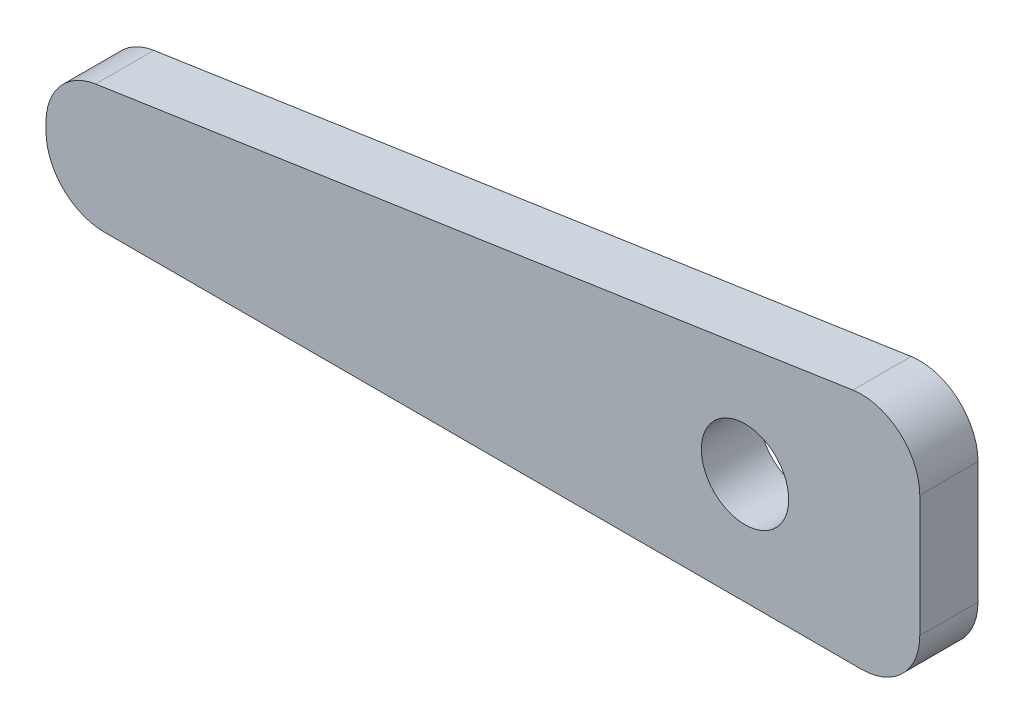
ISO-10303-21;
HEADER;
FILE_DESCRIPTION(('STEP AP214'),'2;1');
FILE_NAME('part.step','',(''),(''),'','','');
FILE_SCHEMA(('AUTOMOTIVE_DESIGN { 1 0 10303 214 1 1 1 1 }'));
ENDSEC;
DATA;
#1=APPLICATION_CONTEXT('core data for automotive mechanical design processes');
#2=APPLICATION_PROTOCOL_DEFINITION('international standard','automotive_design',2000,#1);
#3=PRODUCT_CONTEXT('',#1,'mechanical');
#4=PRODUCT('Part','Part','',(#3));
#5=PRODUCT_RELATED_PRODUCT_CATEGORY('part','',(#4));
#6=PRODUCT_DEFINITION_FORMATION('','',#4);
#7=PRODUCT_DEFINITION_CONTEXT('part definition',#1,'design');
#8=PRODUCT_DEFINITION('design','',#6,#7);
#9=PRODUCT_DEFINITION_SHAPE('','',#8);
#10=(LENGTH_UNIT() NAMED_UNIT(*) SI_UNIT(.MILLI.,.METRE.));
#11=(NAMED_UNIT(*) PLANE_ANGLE_UNIT() SI_UNIT($,.RADIAN.));
#12=(NAMED_UNIT(*) SI_UNIT($,.STERADIAN.) SOLID_ANGLE_UNIT());
#13=UNCERTAINTY_MEASURE_WITH_UNIT(LENGTH_MEASURE(1.E-05),#10,'distance_accuracy_value','');
#14=(GEOMETRIC_REPRESENTATION_CONTEXT(3) GLOBAL_UNCERTAINTY_ASSIGNED_CONTEXT((#13)) GLOBAL_UNIT_ASSIGNED_CONTEXT((#10,
#11,#12)) REPRESENTATION_CONTEXT('',''));
#15=CARTESIAN_POINT('',(0.,0.,0.));
#16=DIRECTION('',(0.,0.,1.));
#17=DIRECTION('',(1.,0.,0.));
#18=AXIS2_PLACEMENT_3D('',#15,#16,#17);
#19=CARTESIAN_POINT('',(-377.825,3.17499999999995,3.175));
#20=DIRECTION('',(0.,0.,-1.));
#21=DIRECTION('',(-1.,0.,0.));
#22=AXIS2_PLACEMENT_3D('',#19,#20,#21);
#23=CYLINDRICAL_SURFACE('',#22,3.17499999999999);
#24=CARTESIAN_POINT('',(-377.825,3.17499999999995,0.));
#25=DIRECTION('',(0.,0.,1.));
#26=DIRECTION('',(1.,0.,0.));
#27=AXIS2_PLACEMENT_3D('',#24,#25,#26);
#28=CIRCLE('',#27,3.17499999999999);
#29=CARTESIAN_POINT('',(-377.825,0.,0.));
#30=VERTEX_POINT('',#29);
#31=CARTESIAN_POINT('',(-381.,3.17499999999998,0.));
#32=VERTEX_POINT('',#31);
#33=EDGE_CURVE('E130',#30,#32,#28,.F.);
#34=ORIENTED_EDGE('',*,*,#33,.F.);
#35=DIRECTION('',(0.,0.,-1.));
#36=VECTOR('',#35,1.);
#37=CARTESIAN_POINT('',(-377.825,0.,3.175));
#38=LINE('',#37,#36);
#39=CARTESIAN_POINT('',(-377.825,0.,3.175));
#40=VERTEX_POINT('',#39);
#41=EDGE_CURVE('E11',#40,#30,#38,.T.);
#42=ORIENTED_EDGE('',*,*,#41,.F.);
#43=CARTESIAN_POINT('',(-377.825,3.17499999999995,3.175));
#44=DIRECTION('',(0.,0.,1.));
#45=DIRECTION('',(1.,0.,0.));
#46=AXIS2_PLACEMENT_3D('',#43,#44,#45);
#47=CIRCLE('',#46,3.17499999999999);
#48=CARTESIAN_POINT('',(-381.,3.17499999999998,3.175));
#49=VERTEX_POINT('',#48);
#50=EDGE_CURVE('E179',#40,#49,#47,.F.);
#51=ORIENTED_EDGE('',*,*,#50,.T.);
#52=DIRECTION('',(0.,0.,-1.));
#53=VECTOR('',#52,1.);
#54=CARTESIAN_POINT('',(-381.,3.17499999999998,3.175));
#55=LINE('',#54,#53);
#56=EDGE_CURVE('E50',#49,#32,#55,.T.);
#57=ORIENTED_EDGE('',*,*,#56,.T.);
#58=EDGE_LOOP('',(#34,#42,#51,#57));
#59=FACE_BOUND('',#58,.T.);
#60=ADVANCED_FACE('F33',(#59),#23,.T.);
#61=CARTESIAN_POINT('',(0.,0.,3.175));
#62=DIRECTION('',(0.,-1.,0.));
#63=DIRECTION('',(1.,0.,0.));
#64=AXIS2_PLACEMENT_3D('',#61,#62,#63);
#65=PLANE('',#64);
#66=DIRECTION('',(-1.,0.,0.));
#67=VECTOR('',#66,1.);
#68=CARTESIAN_POINT('',(0.,0.,0.));
#69=LINE('',#68,#67);
#70=CARTESIAN_POINT('',(-336.55,0.,0.));
#71=VERTEX_POINT('',#70);
#72=EDGE_CURVE('E132',#71,#30,#69,.T.);
#73=ORIENTED_EDGE('',*,*,#72,.F.);
#74=DIRECTION('',(0.,0.,-1.));
#75=VECTOR('',#74,1.);
#76=CARTESIAN_POINT('',(-336.55,0.,3.175));
#77=LINE('',#76,#75);
#78=CARTESIAN_POINT('',(-336.55,0.,3.175));
#79=VERTEX_POINT('',#78);
#80=EDGE_CURVE('E42',#79,#71,#77,.T.);
#81=ORIENTED_EDGE('',*,*,#80,.F.);
#82=DIRECTION('',(-1.,0.,0.));
#83=VECTOR('',#82,1.);
#84=CARTESIAN_POINT('',(0.,0.,3.175));
#85=LINE('',#84,#83);
#86=EDGE_CURVE('E176',#79,#40,#85,.T.);
#87=ORIENTED_EDGE('',*,*,#86,.T.);
#88=ORIENTED_EDGE('',*,*,#41,.T.);
#89=EDGE_LOOP('',(#73,#81,#87,#88));
#90=FACE_BOUND('',#89,.T.);
#91=ADVANCED_FACE('F167',(#90),#65,.T.);
#92=CARTESIAN_POINT('',(-336.55,3.17499999999996,3.175));
#93=DIRECTION('',(0.,0.,-1.));
#94=DIRECTION('',(-1.,0.,0.));
#95=AXIS2_PLACEMENT_3D('',#92,#93,#94);
#96=CYLINDRICAL_SURFACE('',#95,3.17499999999999);
#97=CARTESIAN_POINT('',(-336.55,3.17499999999996,0.));
#98=DIRECTION('',(0.,0.,1.));
#99=DIRECTION('',(1.,0.,0.));
#100=AXIS2_PLACEMENT_3D('',#97,#98,#99);
#101=CIRCLE('',#100,3.17499999999999);
#102=CARTESIAN_POINT('',(-333.375,3.17499999999998,0.));
#103=VERTEX_POINT('',#102);
#104=EDGE_CURVE('E135',#103,#71,#101,.F.);
#105=ORIENTED_EDGE('',*,*,#104,.F.);
#106=DIRECTION('',(0.,0.,-1.));
#107=VECTOR('',#106,1.);
#108=CARTESIAN_POINT('',(-333.375,3.17499999999998,3.175));
#109=LINE('',#108,#107);
#110=CARTESIAN_POINT('',(-333.375,3.17499999999998,3.175));
#111=VERTEX_POINT('',#110);
#112=EDGE_CURVE('E156',#111,#103,#109,.T.);
#113=ORIENTED_EDGE('',*,*,#112,.F.);
#114=CARTESIAN_POINT('',(-336.55,3.17499999999996,3.175));
#115=DIRECTION('',(0.,0.,1.));
#116=DIRECTION('',(1.,0.,0.));
#117=AXIS2_PLACEMENT_3D('',#114,#115,#116);
#118=CIRCLE('',#117,3.17499999999999);
#119=EDGE_CURVE('E163',#111,#79,#118,.F.);
#120=ORIENTED_EDGE('',*,*,#119,.T.);
#121=ORIENTED_EDGE('',*,*,#80,.T.);
#122=EDGE_LOOP('',(#105,#113,#120,#121));
#123=FACE_BOUND('',#122,.T.);
#124=ADVANCED_FACE('F161',(#123),#96,.T.);
#125=CARTESIAN_POINT('',(-333.375,0.,3.175));
#126=DIRECTION('',(1.,0.,0.));
#127=DIRECTION('',(0.,0.,-1.));
#128=AXIS2_PLACEMENT_3D('',#125,#126,#127);
#129=PLANE('',#128);
#130=DIRECTION('',(0.,-1.,0.));
#131=VECTOR('',#130,1.);
#132=CARTESIAN_POINT('',(-333.375,0.,0.));
#133=LINE('',#132,#131);
#134=CARTESIAN_POINT('',(-333.375,9.80697993893506,0.));
#135=VERTEX_POINT('',#134);
#136=EDGE_CURVE('E138',#135,#103,#133,.T.);
#137=ORIENTED_EDGE('',*,*,#136,.F.);
#138=DIRECTION('',(0.,0.,-1.));
#139=VECTOR('',#138,1.);
#140=CARTESIAN_POINT('',(-333.375,9.80697993893506,3.175));
#141=LINE('',#140,#139);
#142=CARTESIAN_POINT('',(-333.375,9.80697993893506,3.175));
#143=VERTEX_POINT('',#142);
#144=EDGE_CURVE('E154',#143,#135,#141,.T.);
#145=ORIENTED_EDGE('',*,*,#144,.F.);
#146=DIRECTION('',(0.,-1.,0.));
#147=VECTOR('',#146,1.);
#148=CARTESIAN_POINT('',(-333.375,0.,3.175));
#149=LINE('',#148,#147);
#150=EDGE_CURVE('E175',#143,#111,#149,.T.);
#151=ORIENTED_EDGE('',*,*,#150,.T.);
#152=ORIENTED_EDGE('',*,*,#112,.T.);
#153=EDGE_LOOP('',(#137,#145,#151,#152));
#154=FACE_BOUND('',#153,.T.);
#155=ADVANCED_FACE('F173',(#154),#129,.T.);
#156=CARTESIAN_POINT('',(-336.55,9.80697993893509,3.175));
#157=DIRECTION('',(0.,0.,-1.));
#158=DIRECTION('',(-1.,0.,0.));
#159=AXIS2_PLACEMENT_3D('',#156,#157,#158);
#160=CYLINDRICAL_SURFACE('',#159,3.17499999999999);
#161=CARTESIAN_POINT('',(-336.55,9.80697993893509,0.));
#162=DIRECTION('',(0.,0.,1.));
#163=DIRECTION('',(1.,0.,0.));
#164=AXIS2_PLACEMENT_3D('',#161,#162,#163);
#165=CIRCLE('',#164,3.17499999999999);
#166=CARTESIAN_POINT('',(-337.020980938054,12.9468528592919,0.));
#167=VERTEX_POINT('',#166);
#168=EDGE_CURVE('E141',#135,#167,#165,.T.);
#169=ORIENTED_EDGE('',*,*,#168,.T.);
#170=DIRECTION('',(0.,0.,-1.));
#171=VECTOR('',#170,1.);
#172=CARTESIAN_POINT('',(-337.020980938054,12.9468528592919,3.175));
#173=LINE('',#172,#171);
#174=CARTESIAN_POINT('',(-337.020980938054,12.9468528592919,3.175));
#175=VERTEX_POINT('',#174);
#176=EDGE_CURVE('E109',#175,#167,#173,.T.);
#177=ORIENTED_EDGE('',*,*,#176,.F.);
#178=CARTESIAN_POINT('',(-336.55,9.80697993893509,3.175));
#179=DIRECTION('',(0.,0.,1.));
#180=DIRECTION('',(1.,0.,0.));
#181=AXIS2_PLACEMENT_3D('',#178,#179,#180);
#182=CIRCLE('',#181,3.17499999999999);
#183=EDGE_CURVE('E118',#143,#175,#182,.T.);
#184=ORIENTED_EDGE('',*,*,#183,.F.);
#185=ORIENTED_EDGE('',*,*,#144,.T.);
#186=EDGE_LOOP('',(#169,#177,#184,#185));
#187=FACE_BOUND('',#186,.T.);
#188=ADVANCED_FACE('F208',(#187),#160,.T.);
#189=CARTESIAN_POINT('',(-9.31540342298291,62.1026894865526,3.175));
#190=DIRECTION('',(-0.148340452930245,0.988936352868297,0.));
#191=DIRECTION('',(-0.988936352868298,-0.148340452930245,0.));
#192=AXIS2_PLACEMENT_3D('',#189,#190,#191);
#193=PLANE('',#192);
#194=DIRECTION('',(0.988936352868298,0.148340452930245,0.));
#195=VECTOR('',#194,1.);
#196=CARTESIAN_POINT('',(-9.31540342298291,62.1026894865526,0.));
#197=LINE('',#196,#195);
#198=CARTESIAN_POINT('',(-378.295980938054,6.75560285929194,0.));
#199=VERTEX_POINT('',#198);
#200=EDGE_CURVE('E105',#199,#167,#197,.T.);
#201=ORIENTED_EDGE('',*,*,#200,.F.);
#202=DIRECTION('',(0.,0.,-1.));
#203=VECTOR('',#202,1.);
#204=CARTESIAN_POINT('',(-378.295980938054,6.75560285929194,3.175));
#205=LINE('',#204,#203);
#206=CARTESIAN_POINT('',(-378.295980938054,6.75560285929194,3.175));
#207=VERTEX_POINT('',#206);
#208=EDGE_CURVE('E100',#207,#199,#205,.T.);
#209=ORIENTED_EDGE('',*,*,#208,.F.);
#210=DIRECTION('',(0.988936352868298,0.148340452930245,0.));
#211=VECTOR('',#210,1.);
#212=CARTESIAN_POINT('',(-9.31540342298291,62.1026894865526,3.175));
#213=LINE('',#212,#211);
#214=EDGE_CURVE('E103',#207,#175,#213,.T.);
#215=ORIENTED_EDGE('',*,*,#214,.T.);
#216=ORIENTED_EDGE('',*,*,#176,.T.);
#217=EDGE_LOOP('',(#201,#209,#215,#216));
#218=FACE_BOUND('',#217,.T.);
#219=ADVANCED_FACE('F102',(#218),#193,.T.);
#220=CARTESIAN_POINT('',(-377.825,3.61572993893508,3.175));
#221=DIRECTION('',(0.,0.,-1.));
#222=DIRECTION('',(-1.,0.,0.));
#223=AXIS2_PLACEMENT_3D('',#220,#221,#222);
#224=CYLINDRICAL_SURFACE('',#223,3.17499999999999);
#225=CARTESIAN_POINT('',(-377.825,3.61572993893508,0.));
#226=DIRECTION('',(0.,0.,1.));
#227=DIRECTION('',(1.,0.,0.));
#228=AXIS2_PLACEMENT_3D('',#225,#226,#227);
#229=CIRCLE('',#228,3.17499999999999);
#230=CARTESIAN_POINT('',(-381.,3.61572993893506,0.));
#231=VERTEX_POINT('',#230);
#232=EDGE_CURVE('E145',#231,#199,#229,.F.);
#233=ORIENTED_EDGE('',*,*,#232,.F.);
#234=DIRECTION('',(0.,0.,-1.));
#235=VECTOR('',#234,1.);
#236=CARTESIAN_POINT('',(-381.,3.61572993893506,3.175));
#237=LINE('',#236,#235);
#238=CARTESIAN_POINT('',(-381.,3.61572993893506,3.175));
#239=VERTEX_POINT('',#238);
#240=EDGE_CURVE('E75',#239,#231,#237,.T.);
#241=ORIENTED_EDGE('',*,*,#240,.F.);
#242=CARTESIAN_POINT('',(-377.825,3.61572993893508,3.175));
#243=DIRECTION('',(0.,0.,1.));
#244=DIRECTION('',(1.,0.,0.));
#245=AXIS2_PLACEMENT_3D('',#242,#243,#244);
#246=CIRCLE('',#245,3.17499999999999);
#247=EDGE_CURVE('E115',#239,#207,#246,.F.);
#248=ORIENTED_EDGE('',*,*,#247,.T.);
#249=ORIENTED_EDGE('',*,*,#208,.T.);
#250=EDGE_LOOP('',(#233,#241,#248,#249));
#251=FACE_BOUND('',#250,.T.);
#252=ADVANCED_FACE('F121',(#251),#224,.T.);
#253=CARTESIAN_POINT('',(-342.9,6.03249999999891,3.175));
#254=DIRECTION('',(0.,0.,-1.));
#255=DIRECTION('',(-1.,0.,0.));
#256=AXIS2_PLACEMENT_3D('',#253,#254,#255);
#257=CYLINDRICAL_SURFACE('',#256,2.38125000000001);
#258=CARTESIAN_POINT('',(-342.9,6.03249999999891,3.175));
#259=DIRECTION('',(0.,0.,1.));
#260=DIRECTION('',(1.,0.,0.));
#261=AXIS2_PLACEMENT_3D('',#258,#259,#260);
#262=CIRCLE('',#261,2.38125000000001);
#263=CARTESIAN_POINT('',(-340.51875,6.03249999999891,3.175));
#264=VERTEX_POINT('',#263);
#265=EDGE_CURVE('E150',#264,#264,#262,.T.);
#266=ORIENTED_EDGE('',*,*,#265,.T.);
#267=EDGE_LOOP('',(#266));
#268=FACE_BOUND('',#267,.T.);
#269=CARTESIAN_POINT('',(-342.9,6.03249999999891,0.));
#270=DIRECTION('',(0.,0.,1.));
#271=DIRECTION('',(1.,0.,0.));
#272=AXIS2_PLACEMENT_3D('',#269,#270,#271);
#273=CIRCLE('',#272,2.38125000000001);
#274=CARTESIAN_POINT('',(-340.51875,6.03249999999891,0.));
#275=VERTEX_POINT('',#274);
#276=EDGE_CURVE('E127',#275,#275,#273,.T.);
#277=ORIENTED_EDGE('',*,*,#276,.F.);
#278=EDGE_LOOP('',(#277));
#279=FACE_BOUND('',#278,.T.);
#280=ADVANCED_FACE('F35',(#268,#279),#257,.F.);
#281=CARTESIAN_POINT('',(-381.,0.,3.175));
#282=DIRECTION('',(-1.,0.,0.));
#283=DIRECTION('',(0.,0.,1.));
#284=AXIS2_PLACEMENT_3D('',#281,#282,#283);
#285=PLANE('',#284);
#286=DIRECTION('',(0.,1.,0.));
#287=VECTOR('',#286,1.);
#288=CARTESIAN_POINT('',(-381.,0.,0.));
#289=LINE('',#288,#287);
#290=EDGE_CURVE('E147',#32,#231,#289,.T.);
#291=ORIENTED_EDGE('',*,*,#290,.F.);
#292=ORIENTED_EDGE('',*,*,#56,.F.);
#293=DIRECTION('',(0.,1.,0.));
#294=VECTOR('',#293,1.);
#295=CARTESIAN_POINT('',(-381.,0.,3.175));
#296=LINE('',#295,#294);
#297=EDGE_CURVE('E122',#49,#239,#296,.T.);
#298=ORIENTED_EDGE('',*,*,#297,.T.);
#299=ORIENTED_EDGE('',*,*,#240,.T.);
#300=EDGE_LOOP('',(#291,#292,#298,#299));
#301=FACE_BOUND('',#300,.T.);
#302=ADVANCED_FACE('F189',(#301),#285,.T.);
#303=CARTESIAN_POINT('',(0.,0.,3.175));
#304=DIRECTION('',(0.,0.,1.));
#305=DIRECTION('',(1.,0.,0.));
#306=AXIS2_PLACEMENT_3D('',#303,#304,#305);
#307=PLANE('',#306);
#308=ORIENTED_EDGE('',*,*,#265,.F.);
#309=EDGE_LOOP('',(#308));
#310=FACE_BOUND('',#309,.T.);
#311=ORIENTED_EDGE('',*,*,#50,.F.);
#312=ORIENTED_EDGE('',*,*,#86,.F.);
#313=ORIENTED_EDGE('',*,*,#119,.F.);
#314=ORIENTED_EDGE('',*,*,#150,.F.);
#315=ORIENTED_EDGE('',*,*,#183,.T.);
#316=ORIENTED_EDGE('',*,*,#214,.F.);
#317=ORIENTED_EDGE('',*,*,#247,.F.);
#318=ORIENTED_EDGE('',*,*,#297,.F.);
#319=EDGE_LOOP('',(#311,#312,#313,#314,#315,#316,#317,#318));
#320=FACE_BOUND('',#319,.T.);
#321=ADVANCED_FACE('F113',(#310,#320),#307,.T.);
#322=CARTESIAN_POINT('',(0.,0.,0.));
#323=DIRECTION('',(0.,0.,1.));
#324=DIRECTION('',(1.,0.,0.));
#325=AXIS2_PLACEMENT_3D('',#322,#323,#324);
#326=PLANE('',#325);
#327=ORIENTED_EDGE('',*,*,#276,.T.);
#328=EDGE_LOOP('',(#327));
#329=FACE_BOUND('',#328,.T.);
#330=ORIENTED_EDGE('',*,*,#33,.T.);
#331=ORIENTED_EDGE('',*,*,#290,.T.);
#332=ORIENTED_EDGE('',*,*,#232,.T.);
#333=ORIENTED_EDGE('',*,*,#200,.T.);
#334=ORIENTED_EDGE('',*,*,#168,.F.);
#335=ORIENTED_EDGE('',*,*,#136,.T.);
#336=ORIENTED_EDGE('',*,*,#104,.T.);
#337=ORIENTED_EDGE('',*,*,#72,.T.);
#338=EDGE_LOOP('',(#330,#331,#332,#333,#334,#335,#336,#337));
#339=FACE_BOUND('',#338,.T.);
#340=ADVANCED_FACE('F169',(#329,#339),#326,.F.);
#341=CLOSED_SHELL('',(#60,#91,#124,#155,#188,#219,#252,#280,#302,#321,#340));
#342=MANIFOLD_SOLID_BREP('B2',#341);
#343=ADVANCED_BREP_SHAPE_REPRESENTATION('',(#18,#342),#14);
#344=SHAPE_DEFINITION_REPRESENTATION(#9,#343);
ENDSEC;
END-ISO-10303-21;
